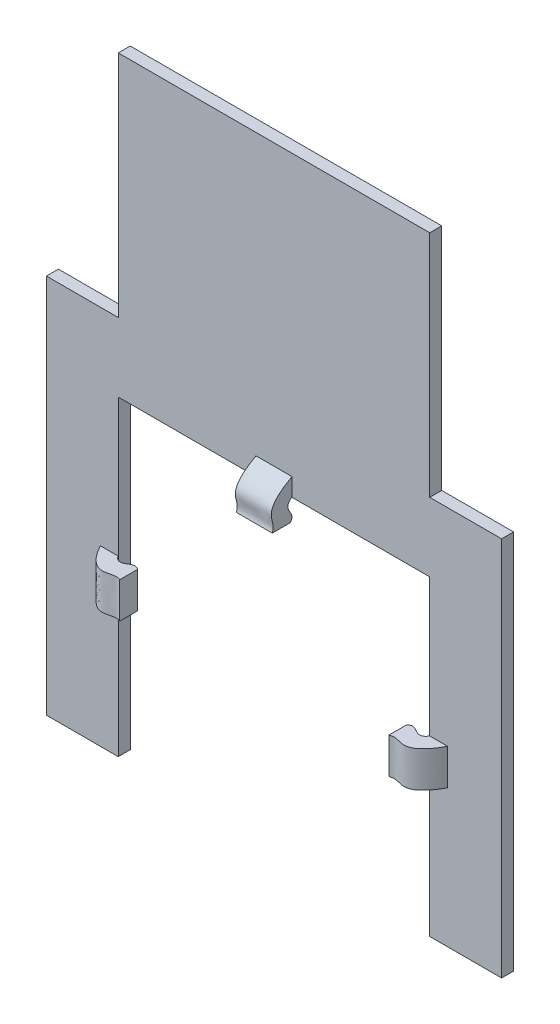
ISO-10303-21;
HEADER;
FILE_DESCRIPTION(('STEP AP214'),'2;1');
FILE_NAME('part.step','',(''),(''),'','','');
FILE_SCHEMA(('AUTOMOTIVE_DESIGN { 1 0 10303 214 1 1 1 1 }'));
ENDSEC;
DATA;
#1=APPLICATION_CONTEXT('core data for automotive mechanical design processes');
#2=APPLICATION_PROTOCOL_DEFINITION('international standard','automotive_design',2000,#1);
#3=PRODUCT_CONTEXT('',#1,'mechanical');
#4=PRODUCT('Part','Part','',(#3));
#5=PRODUCT_RELATED_PRODUCT_CATEGORY('part','',(#4));
#6=PRODUCT_DEFINITION_FORMATION('','',#4);
#7=PRODUCT_DEFINITION_CONTEXT('part definition',#1,'design');
#8=PRODUCT_DEFINITION('design','',#6,#7);
#9=PRODUCT_DEFINITION_SHAPE('','',#8);
#10=(LENGTH_UNIT() NAMED_UNIT(*) SI_UNIT(.MILLI.,.METRE.));
#11=(NAMED_UNIT(*) PLANE_ANGLE_UNIT() SI_UNIT($,.RADIAN.));
#12=(NAMED_UNIT(*) SI_UNIT($,.STERADIAN.) SOLID_ANGLE_UNIT());
#13=UNCERTAINTY_MEASURE_WITH_UNIT(LENGTH_MEASURE(1.E-05),#10,'distance_accuracy_value','');
#14=(GEOMETRIC_REPRESENTATION_CONTEXT(3) GLOBAL_UNCERTAINTY_ASSIGNED_CONTEXT((#13)) GLOBAL_UNIT_ASSIGNED_CONTEXT((#10,
#11,#12)) REPRESENTATION_CONTEXT('',''));
#15=CARTESIAN_POINT('',(0.,0.,0.));
#16=DIRECTION('',(0.,0.,1.));
#17=DIRECTION('',(1.,0.,0.));
#18=AXIS2_PLACEMENT_3D('',#15,#16,#17);
#19=CARTESIAN_POINT('',(0.,-15.315,1.));
#20=DIRECTION('',(0.,1.,0.));
#21=DIRECTION('',(0.,0.,1.));
#22=AXIS2_PLACEMENT_3D('',#19,#20,#21);
#23=PLANE('',#22);
#24=DIRECTION('',(1.,0.,0.));
#25=VECTOR('',#24,1.);
#26=CARTESIAN_POINT('',(0.,-15.315,0.));
#27=LINE('',#26,#25);
#28=CARTESIAN_POINT('',(-13.,-15.315,0.));
#29=VERTEX_POINT('',#28);
#30=CARTESIAN_POINT('',(13.,-15.315,0.));
#31=VERTEX_POINT('',#30);
#32=EDGE_CURVE('E300',#29,#31,#27,.T.);
#33=ORIENTED_EDGE('',*,*,#32,.T.);
#34=DIRECTION('',(0.,0.,-1.));
#35=VECTOR('',#34,1.);
#36=CARTESIAN_POINT('',(13.,-15.315,1.));
#37=LINE('',#36,#35);
#38=CARTESIAN_POINT('',(13.,-15.315,1.));
#39=VERTEX_POINT('',#38);
#40=EDGE_CURVE('E11',#39,#31,#37,.T.);
#41=ORIENTED_EDGE('',*,*,#40,.F.);
#42=DIRECTION('',(1.,0.,0.));
#43=VECTOR('',#42,1.);
#44=CARTESIAN_POINT('',(0.,-15.315,1.));
#45=LINE('',#44,#43);
#46=CARTESIAN_POINT('',(1.49999999999996,-15.315,1.));
#47=VERTEX_POINT('',#46);
#48=EDGE_CURVE('E312',#47,#39,#45,.T.);
#49=ORIENTED_EDGE('',*,*,#48,.F.);
#50=DIRECTION('',(1.,0.,0.));
#51=VECTOR('',#50,1.);
#52=CARTESIAN_POINT('',(-1.50000000000005,-15.315,1.));
#53=LINE('',#52,#51);
#54=CARTESIAN_POINT('',(-1.50000000000005,-15.315,1.));
#55=VERTEX_POINT('',#54);
#56=EDGE_CURVE('E492',#55,#47,#53,.T.);
#57=ORIENTED_EDGE('',*,*,#56,.F.);
#58=CARTESIAN_POINT('',(-13.,-15.315,1.));
#59=VERTEX_POINT('',#58);
#60=EDGE_CURVE('E308',#59,#55,#45,.T.);
#61=ORIENTED_EDGE('',*,*,#60,.F.);
#62=DIRECTION('',(0.,0.,-1.));
#63=VECTOR('',#62,1.);
#64=CARTESIAN_POINT('',(-13.,-15.315,1.));
#65=LINE('',#64,#63);
#66=EDGE_CURVE('E339',#59,#29,#65,.T.);
#67=ORIENTED_EDGE('',*,*,#66,.T.);
#68=EDGE_LOOP('',(#33,#41,#49,#57,#61,#67));
#69=FACE_BOUND('',#68,.T.);
#70=ADVANCED_FACE('F34',(#69),#23,.F.);
#71=CARTESIAN_POINT('',(13.,0.,1.));
#72=DIRECTION('',(1.,0.,0.));
#73=DIRECTION('',(0.,0.,-1.));
#74=AXIS2_PLACEMENT_3D('',#71,#72,#73);
#75=PLANE('',#74);
#76=DIRECTION('',(0.,-1.,0.));
#77=VECTOR('',#76,1.);
#78=CARTESIAN_POINT('',(13.,0.,0.));
#79=LINE('',#78,#77);
#80=CARTESIAN_POINT('',(13.,-41.315,0.));
#81=VERTEX_POINT('',#80);
#82=EDGE_CURVE('E343',#31,#81,#79,.T.);
#83=ORIENTED_EDGE('',*,*,#82,.T.);
#84=DIRECTION('',(0.,0.,-1.));
#85=VECTOR('',#84,1.);
#86=CARTESIAN_POINT('',(13.,-41.315,1.));
#87=LINE('',#86,#85);
#88=CARTESIAN_POINT('',(13.,-41.315,1.));
#89=VERTEX_POINT('',#88);
#90=EDGE_CURVE('E41',#89,#81,#87,.T.);
#91=ORIENTED_EDGE('',*,*,#90,.F.);
#92=DIRECTION('',(0.,-1.,0.));
#93=VECTOR('',#92,1.);
#94=CARTESIAN_POINT('',(13.,0.,1.));
#95=LINE('',#94,#93);
#96=CARTESIAN_POINT('',(13.,-29.815,1.));
#97=VERTEX_POINT('',#96);
#98=EDGE_CURVE('E311',#97,#89,#95,.T.);
#99=ORIENTED_EDGE('',*,*,#98,.F.);
#100=DIRECTION('',(0.,-1.,0.));
#101=VECTOR('',#100,1.);
#102=CARTESIAN_POINT('',(13.,-26.815,1.));
#103=LINE('',#102,#101);
#104=CARTESIAN_POINT('',(13.,-26.815,1.));
#105=VERTEX_POINT('',#104);
#106=EDGE_CURVE('E297',#105,#97,#103,.T.);
#107=ORIENTED_EDGE('',*,*,#106,.F.);
#108=EDGE_CURVE('E313',#39,#105,#95,.T.);
#109=ORIENTED_EDGE('',*,*,#108,.F.);
#110=ORIENTED_EDGE('',*,*,#40,.T.);
#111=EDGE_LOOP('',(#83,#91,#99,#107,#109,#110));
#112=FACE_BOUND('',#111,.T.);
#113=ADVANCED_FACE('F483',(#112),#75,.F.);
#114=CARTESIAN_POINT('',(0.,-41.315,1.));
#115=DIRECTION('',(0.,1.,0.));
#116=DIRECTION('',(0.,0.,1.));
#117=AXIS2_PLACEMENT_3D('',#114,#115,#116);
#118=PLANE('',#117);
#119=DIRECTION('',(1.,0.,0.));
#120=VECTOR('',#119,1.);
#121=CARTESIAN_POINT('',(0.,-41.315,0.));
#122=LINE('',#121,#120);
#123=CARTESIAN_POINT('',(19.,-41.315,0.));
#124=VERTEX_POINT('',#123);
#125=EDGE_CURVE('E345',#81,#124,#122,.T.);
#126=ORIENTED_EDGE('',*,*,#125,.T.);
#127=DIRECTION('',(0.,0.,-1.));
#128=VECTOR('',#127,1.);
#129=CARTESIAN_POINT('',(19.,-41.315,1.));
#130=LINE('',#129,#128);
#131=CARTESIAN_POINT('',(19.,-41.315,1.));
#132=VERTEX_POINT('',#131);
#133=EDGE_CURVE('E390',#132,#124,#130,.T.);
#134=ORIENTED_EDGE('',*,*,#133,.F.);
#135=DIRECTION('',(1.,0.,0.));
#136=VECTOR('',#135,1.);
#137=CARTESIAN_POINT('',(0.,-41.315,1.));
#138=LINE('',#137,#136);
#139=EDGE_CURVE('E316',#89,#132,#138,.T.);
#140=ORIENTED_EDGE('',*,*,#139,.F.);
#141=ORIENTED_EDGE('',*,*,#90,.T.);
#142=EDGE_LOOP('',(#126,#134,#140,#141));
#143=FACE_BOUND('',#142,.T.);
#144=ADVANCED_FACE('F396',(#143),#118,.F.);
#145=CARTESIAN_POINT('',(19.,0.,1.));
#146=DIRECTION('',(1.,0.,0.));
#147=DIRECTION('',(0.,1.,0.));
#148=AXIS2_PLACEMENT_3D('',#145,#146,#147);
#149=PLANE('',#148);
#150=DIRECTION('',(0.,-1.,0.));
#151=VECTOR('',#150,1.);
#152=CARTESIAN_POINT('',(19.,0.,0.));
#153=LINE('',#152,#151);
#154=CARTESIAN_POINT('',(19.,-9.56499999999999,0.));
#155=VERTEX_POINT('',#154);
#156=EDGE_CURVE('E348',#155,#124,#153,.T.);
#157=ORIENTED_EDGE('',*,*,#156,.F.);
#158=DIRECTION('',(0.,0.,-1.));
#159=VECTOR('',#158,1.);
#160=CARTESIAN_POINT('',(19.,-9.56499999999999,1.));
#161=LINE('',#160,#159);
#162=CARTESIAN_POINT('',(19.,-9.56499999999999,1.));
#163=VERTEX_POINT('',#162);
#164=EDGE_CURVE('E388',#163,#155,#161,.T.);
#165=ORIENTED_EDGE('',*,*,#164,.F.);
#166=DIRECTION('',(0.,-1.,0.));
#167=VECTOR('',#166,1.);
#168=CARTESIAN_POINT('',(19.,0.,1.));
#169=LINE('',#168,#167);
#170=EDGE_CURVE('E318',#163,#132,#169,.T.);
#171=ORIENTED_EDGE('',*,*,#170,.T.);
#172=ORIENTED_EDGE('',*,*,#133,.T.);
#173=EDGE_LOOP('',(#157,#165,#171,#172));
#174=FACE_BOUND('',#173,.T.);
#175=ADVANCED_FACE('F406',(#174),#149,.T.);
#176=CARTESIAN_POINT('',(0.,-9.56499999999999,1.));
#177=DIRECTION('',(0.,1.,0.));
#178=DIRECTION('',(0.,0.,1.));
#179=AXIS2_PLACEMENT_3D('',#176,#177,#178);
#180=PLANE('',#179);
#181=DIRECTION('',(1.,0.,0.));
#182=VECTOR('',#181,1.);
#183=CARTESIAN_POINT('',(0.,-9.56499999999999,0.));
#184=LINE('',#183,#182);
#185=CARTESIAN_POINT('',(13.,-9.56499999999999,0.));
#186=VERTEX_POINT('',#185);
#187=EDGE_CURVE('E352',#186,#155,#184,.T.);
#188=ORIENTED_EDGE('',*,*,#187,.F.);
#189=DIRECTION('',(0.,0.,-1.));
#190=VECTOR('',#189,1.);
#191=CARTESIAN_POINT('',(13.,-9.56499999999999,1.));
#192=LINE('',#191,#190);
#193=CARTESIAN_POINT('',(13.,-9.56499999999999,1.));
#194=VERTEX_POINT('',#193);
#195=EDGE_CURVE('E386',#194,#186,#192,.T.);
#196=ORIENTED_EDGE('',*,*,#195,.F.);
#197=DIRECTION('',(1.,0.,0.));
#198=VECTOR('',#197,1.);
#199=CARTESIAN_POINT('',(0.,-9.56499999999999,1.));
#200=LINE('',#199,#198);
#201=EDGE_CURVE('E322',#194,#163,#200,.T.);
#202=ORIENTED_EDGE('',*,*,#201,.T.);
#203=ORIENTED_EDGE('',*,*,#164,.T.);
#204=EDGE_LOOP('',(#188,#196,#202,#203));
#205=FACE_BOUND('',#204,.T.);
#206=ADVANCED_FACE('F411',(#205),#180,.T.);
#207=CARTESIAN_POINT('',(13.,0.,1.));
#208=DIRECTION('',(1.,0.,0.));
#209=DIRECTION('',(0.,0.,-1.));
#210=AXIS2_PLACEMENT_3D('',#207,#208,#209);
#211=PLANE('',#210);
#212=DIRECTION('',(0.,-1.,0.));
#213=VECTOR('',#212,1.);
#214=CARTESIAN_POINT('',(13.,0.,0.));
#215=LINE('',#214,#213);
#216=CARTESIAN_POINT('',(13.,9.565,0.));
#217=VERTEX_POINT('',#216);
#218=EDGE_CURVE('E355',#217,#186,#215,.T.);
#219=ORIENTED_EDGE('',*,*,#218,.F.);
#220=DIRECTION('',(0.,0.,-1.));
#221=VECTOR('',#220,1.);
#222=CARTESIAN_POINT('',(13.,9.565,1.));
#223=LINE('',#222,#221);
#224=CARTESIAN_POINT('',(13.,9.565,1.));
#225=VERTEX_POINT('',#224);
#226=EDGE_CURVE('E384',#225,#217,#223,.T.);
#227=ORIENTED_EDGE('',*,*,#226,.F.);
#228=DIRECTION('',(0.,-1.,0.));
#229=VECTOR('',#228,1.);
#230=CARTESIAN_POINT('',(13.,0.,1.));
#231=LINE('',#230,#229);
#232=EDGE_CURVE('E325',#225,#194,#231,.T.);
#233=ORIENTED_EDGE('',*,*,#232,.T.);
#234=ORIENTED_EDGE('',*,*,#195,.T.);
#235=EDGE_LOOP('',(#219,#227,#233,#234));
#236=FACE_BOUND('',#235,.T.);
#237=ADVANCED_FACE('F414',(#236),#211,.T.);
#238=CARTESIAN_POINT('',(0.,9.56500000000001,1.));
#239=DIRECTION('',(0.,-1.,0.));
#240=DIRECTION('',(1.,0.,0.));
#241=AXIS2_PLACEMENT_3D('',#238,#239,#240);
#242=PLANE('',#241);
#243=DIRECTION('',(-1.,0.,0.));
#244=VECTOR('',#243,1.);
#245=CARTESIAN_POINT('',(0.,9.56500000000001,0.));
#246=LINE('',#245,#244);
#247=CARTESIAN_POINT('',(-13.,9.56500000000001,0.));
#248=VERTEX_POINT('',#247);
#249=EDGE_CURVE('E358',#217,#248,#246,.T.);
#250=ORIENTED_EDGE('',*,*,#249,.T.);
#251=DIRECTION('',(0.,0.,-1.));
#252=VECTOR('',#251,1.);
#253=CARTESIAN_POINT('',(-13.,9.56500000000001,1.));
#254=LINE('',#253,#252);
#255=CARTESIAN_POINT('',(-13.,9.56500000000001,1.));
#256=VERTEX_POINT('',#255);
#257=EDGE_CURVE('E381',#256,#248,#254,.T.);
#258=ORIENTED_EDGE('',*,*,#257,.F.);
#259=DIRECTION('',(-1.,0.,0.));
#260=VECTOR('',#259,1.);
#261=CARTESIAN_POINT('',(0.,9.56500000000001,1.));
#262=LINE('',#261,#260);
#263=EDGE_CURVE('E328',#225,#256,#262,.T.);
#264=ORIENTED_EDGE('',*,*,#263,.F.);
#265=ORIENTED_EDGE('',*,*,#226,.T.);
#266=EDGE_LOOP('',(#250,#258,#264,#265));
#267=FACE_BOUND('',#266,.T.);
#268=ADVANCED_FACE('F421',(#267),#242,.F.);
#269=CARTESIAN_POINT('',(-13.,0.,1.));
#270=DIRECTION('',(1.,0.,0.));
#271=DIRECTION('',(0.,0.,-1.));
#272=AXIS2_PLACEMENT_3D('',#269,#270,#271);
#273=PLANE('',#272);
#274=DIRECTION('',(0.,-1.,0.));
#275=VECTOR('',#274,1.);
#276=CARTESIAN_POINT('',(-13.,0.,0.));
#277=LINE('',#276,#275);
#278=CARTESIAN_POINT('',(-13.,-9.56500000000001,0.));
#279=VERTEX_POINT('',#278);
#280=EDGE_CURVE('E360',#248,#279,#277,.T.);
#281=ORIENTED_EDGE('',*,*,#280,.T.);
#282=DIRECTION('',(0.,0.,-1.));
#283=VECTOR('',#282,1.);
#284=CARTESIAN_POINT('',(-13.,-9.56500000000001,1.));
#285=LINE('',#284,#283);
#286=CARTESIAN_POINT('',(-13.,-9.56500000000001,1.));
#287=VERTEX_POINT('',#286);
#288=EDGE_CURVE('E379',#287,#279,#285,.T.);
#289=ORIENTED_EDGE('',*,*,#288,.F.);
#290=DIRECTION('',(0.,-1.,0.));
#291=VECTOR('',#290,1.);
#292=CARTESIAN_POINT('',(-13.,0.,1.));
#293=LINE('',#292,#291);
#294=EDGE_CURVE('E330',#256,#287,#293,.T.);
#295=ORIENTED_EDGE('',*,*,#294,.F.);
#296=ORIENTED_EDGE('',*,*,#257,.T.);
#297=EDGE_LOOP('',(#281,#289,#295,#296));
#298=FACE_BOUND('',#297,.T.);
#299=ADVANCED_FACE('F425',(#298),#273,.F.);
#300=CARTESIAN_POINT('',(0.,-9.56500000000004,1.));
#301=DIRECTION('',(0.,1.,0.));
#302=DIRECTION('',(-1.,0.,0.));
#303=AXIS2_PLACEMENT_3D('',#300,#301,#302);
#304=PLANE('',#303);
#305=DIRECTION('',(1.,0.,0.));
#306=VECTOR('',#305,1.);
#307=CARTESIAN_POINT('',(0.,-9.56500000000004,0.));
#308=LINE('',#307,#306);
#309=CARTESIAN_POINT('',(-19.,-9.56499999999999,0.));
#310=VERTEX_POINT('',#309);
#311=EDGE_CURVE('E363',#310,#279,#308,.T.);
#312=ORIENTED_EDGE('',*,*,#311,.F.);
#313=DIRECTION('',(0.,0.,-1.));
#314=VECTOR('',#313,1.);
#315=CARTESIAN_POINT('',(-19.,-9.56499999999999,1.));
#316=LINE('',#315,#314);
#317=CARTESIAN_POINT('',(-19.,-9.56499999999999,1.));
#318=VERTEX_POINT('',#317);
#319=EDGE_CURVE('E377',#318,#310,#316,.T.);
#320=ORIENTED_EDGE('',*,*,#319,.F.);
#321=DIRECTION('',(1.,0.,0.));
#322=VECTOR('',#321,1.);
#323=CARTESIAN_POINT('',(0.,-9.56500000000004,1.));
#324=LINE('',#323,#322);
#325=EDGE_CURVE('E332',#318,#287,#324,.T.);
#326=ORIENTED_EDGE('',*,*,#325,.T.);
#327=ORIENTED_EDGE('',*,*,#288,.T.);
#328=EDGE_LOOP('',(#312,#320,#326,#327));
#329=FACE_BOUND('',#328,.T.);
#330=ADVANCED_FACE('F428',(#329),#304,.T.);
#331=CARTESIAN_POINT('',(-19.,0.,1.));
#332=DIRECTION('',(1.,0.,0.));
#333=DIRECTION('',(0.,0.,-1.));
#334=AXIS2_PLACEMENT_3D('',#331,#332,#333);
#335=PLANE('',#334);
#336=DIRECTION('',(0.,-1.,0.));
#337=VECTOR('',#336,1.);
#338=CARTESIAN_POINT('',(-19.,0.,0.));
#339=LINE('',#338,#337);
#340=CARTESIAN_POINT('',(-19.,-41.315,0.));
#341=VERTEX_POINT('',#340);
#342=EDGE_CURVE('E366',#310,#341,#339,.T.);
#343=ORIENTED_EDGE('',*,*,#342,.T.);
#344=DIRECTION('',(0.,0.,-1.));
#345=VECTOR('',#344,1.);
#346=CARTESIAN_POINT('',(-19.,-41.315,1.));
#347=LINE('',#346,#345);
#348=CARTESIAN_POINT('',(-19.,-41.315,1.));
#349=VERTEX_POINT('',#348);
#350=EDGE_CURVE('E374',#349,#341,#347,.T.);
#351=ORIENTED_EDGE('',*,*,#350,.F.);
#352=DIRECTION('',(0.,-1.,0.));
#353=VECTOR('',#352,1.);
#354=CARTESIAN_POINT('',(-19.,0.,1.));
#355=LINE('',#354,#353);
#356=EDGE_CURVE('E335',#318,#349,#355,.T.);
#357=ORIENTED_EDGE('',*,*,#356,.F.);
#358=ORIENTED_EDGE('',*,*,#319,.T.);
#359=EDGE_LOOP('',(#343,#351,#357,#358));
#360=FACE_BOUND('',#359,.T.);
#361=ADVANCED_FACE('F435',(#360),#335,.F.);
#362=CARTESIAN_POINT('',(-13.,-41.315,0.));
#363=VERTEX_POINT('',#362);
#364=EDGE_CURVE('E349',#341,#363,#122,.T.);
#365=ORIENTED_EDGE('',*,*,#364,.T.);
#366=DIRECTION('',(0.,0.,-1.));
#367=VECTOR('',#366,1.);
#368=CARTESIAN_POINT('',(-13.,-41.315,1.));
#369=LINE('',#368,#367);
#370=CARTESIAN_POINT('',(-13.,-41.315,1.));
#371=VERTEX_POINT('',#370);
#372=EDGE_CURVE('E372',#371,#363,#369,.T.);
#373=ORIENTED_EDGE('',*,*,#372,.F.);
#374=EDGE_CURVE('E319',#349,#371,#138,.T.);
#375=ORIENTED_EDGE('',*,*,#374,.F.);
#376=ORIENTED_EDGE('',*,*,#350,.T.);
#377=EDGE_LOOP('',(#365,#373,#375,#376));
#378=FACE_BOUND('',#377,.T.);
#379=ADVANCED_FACE('F440',(#378),#118,.F.);
#380=CARTESIAN_POINT('',(-13.,0.,1.));
#381=DIRECTION('',(1.,0.,0.));
#382=DIRECTION('',(0.,0.,-1.));
#383=AXIS2_PLACEMENT_3D('',#380,#381,#382);
#384=PLANE('',#383);
#385=DIRECTION('',(0.,-1.,0.));
#386=VECTOR('',#385,1.);
#387=CARTESIAN_POINT('',(-13.,0.,0.));
#388=LINE('',#387,#386);
#389=EDGE_CURVE('E368',#29,#363,#388,.T.);
#390=ORIENTED_EDGE('',*,*,#389,.F.);
#391=ORIENTED_EDGE('',*,*,#66,.F.);
#392=DIRECTION('',(0.,-1.,0.));
#393=VECTOR('',#392,1.);
#394=CARTESIAN_POINT('',(-13.,0.,1.));
#395=LINE('',#394,#393);
#396=CARTESIAN_POINT('',(-13.,-26.815,1.));
#397=VERTEX_POINT('',#396);
#398=EDGE_CURVE('E337',#59,#397,#395,.T.);
#399=ORIENTED_EDGE('',*,*,#398,.T.);
#400=DIRECTION('',(0.,1.,0.));
#401=VECTOR('',#400,1.);
#402=CARTESIAN_POINT('',(-13.,-29.815,1.));
#403=LINE('',#402,#401);
#404=CARTESIAN_POINT('',(-13.,-29.815,1.));
#405=VERTEX_POINT('',#404);
#406=EDGE_CURVE('E217',#405,#397,#403,.T.);
#407=ORIENTED_EDGE('',*,*,#406,.F.);
#408=EDGE_CURVE('E340',#405,#371,#395,.T.);
#409=ORIENTED_EDGE('',*,*,#408,.T.);
#410=ORIENTED_EDGE('',*,*,#372,.T.);
#411=EDGE_LOOP('',(#390,#391,#399,#407,#409,#410));
#412=FACE_BOUND('',#411,.T.);
#413=ADVANCED_FACE('F444',(#412),#384,.T.);
#414=CARTESIAN_POINT('',(0.,0.,1.));
#415=DIRECTION('',(0.,0.,1.));
#416=DIRECTION('',(1.,0.,0.));
#417=AXIS2_PLACEMENT_3D('',#414,#415,#416);
#418=PLANE('',#417);
#419=DIRECTION('',(-1.,0.,0.));
#420=VECTOR('',#419,1.);
#421=CARTESIAN_POINT('',(-14.5,-29.815,1.));
#422=LINE('',#421,#420);
#423=CARTESIAN_POINT('',(-14.5,-29.815,1.));
#424=VERTEX_POINT('',#423);
#425=EDGE_CURVE('E216',#405,#424,#422,.T.);
#426=ORIENTED_EDGE('',*,*,#425,.T.);
#427=DIRECTION('',(0.,1.,0.));
#428=VECTOR('',#427,1.);
#429=CARTESIAN_POINT('',(-14.5,-29.815,1.));
#430=LINE('',#429,#428);
#431=CARTESIAN_POINT('',(-14.5,-26.815,1.));
#432=VERTEX_POINT('',#431);
#433=EDGE_CURVE('E208',#424,#432,#430,.T.);
#434=ORIENTED_EDGE('',*,*,#433,.T.);
#435=DIRECTION('',(-1.,0.,0.));
#436=VECTOR('',#435,1.);
#437=CARTESIAN_POINT('',(-14.5,-26.815,1.));
#438=LINE('',#437,#436);
#439=EDGE_CURVE('E195',#397,#432,#438,.T.);
#440=ORIENTED_EDGE('',*,*,#439,.F.);
#441=ORIENTED_EDGE('',*,*,#398,.F.);
#442=ORIENTED_EDGE('',*,*,#60,.T.);
#443=DIRECTION('',(0.,1.,0.));
#444=VECTOR('',#443,1.);
#445=CARTESIAN_POINT('',(-1.50000000000005,-13.815,1.));
#446=LINE('',#445,#444);
#447=CARTESIAN_POINT('',(-1.50000000000005,-13.815,1.));
#448=VERTEX_POINT('',#447);
#449=EDGE_CURVE('E249',#55,#448,#446,.T.);
#450=ORIENTED_EDGE('',*,*,#449,.T.);
#451=DIRECTION('',(1.,0.,0.));
#452=VECTOR('',#451,1.);
#453=CARTESIAN_POINT('',(-1.50000000000005,-13.815,1.));
#454=LINE('',#453,#452);
#455=CARTESIAN_POINT('',(1.49999999999995,-13.815,1.));
#456=VERTEX_POINT('',#455);
#457=EDGE_CURVE('E496',#448,#456,#454,.T.);
#458=ORIENTED_EDGE('',*,*,#457,.T.);
#459=DIRECTION('',(0.,1.,0.));
#460=VECTOR('',#459,1.);
#461=CARTESIAN_POINT('',(1.49999999999995,-13.815,1.));
#462=LINE('',#461,#460);
#463=EDGE_CURVE('E228',#47,#456,#462,.T.);
#464=ORIENTED_EDGE('',*,*,#463,.F.);
#465=ORIENTED_EDGE('',*,*,#48,.T.);
#466=ORIENTED_EDGE('',*,*,#108,.T.);
#467=DIRECTION('',(1.,0.,0.));
#468=VECTOR('',#467,1.);
#469=CARTESIAN_POINT('',(14.5,-26.815,1.));
#470=LINE('',#469,#468);
#471=CARTESIAN_POINT('',(14.5,-26.815,1.));
#472=VERTEX_POINT('',#471);
#473=EDGE_CURVE('E291',#105,#472,#470,.T.);
#474=ORIENTED_EDGE('',*,*,#473,.T.);
#475=DIRECTION('',(0.,-1.,0.));
#476=VECTOR('',#475,1.);
#477=CARTESIAN_POINT('',(14.5,-26.815,1.));
#478=LINE('',#477,#476);
#479=CARTESIAN_POINT('',(14.5,-29.815,1.));
#480=VERTEX_POINT('',#479);
#481=EDGE_CURVE('E303',#472,#480,#478,.T.);
#482=ORIENTED_EDGE('',*,*,#481,.T.);
#483=DIRECTION('',(1.,0.,0.));
#484=VECTOR('',#483,1.);
#485=CARTESIAN_POINT('',(14.5,-29.815,1.));
#486=LINE('',#485,#484);
#487=EDGE_CURVE('E522',#97,#480,#486,.T.);
#488=ORIENTED_EDGE('',*,*,#487,.F.);
#489=ORIENTED_EDGE('',*,*,#98,.T.);
#490=ORIENTED_EDGE('',*,*,#139,.T.);
#491=ORIENTED_EDGE('',*,*,#170,.F.);
#492=ORIENTED_EDGE('',*,*,#201,.F.);
#493=ORIENTED_EDGE('',*,*,#232,.F.);
#494=ORIENTED_EDGE('',*,*,#263,.T.);
#495=ORIENTED_EDGE('',*,*,#294,.T.);
#496=ORIENTED_EDGE('',*,*,#325,.F.);
#497=ORIENTED_EDGE('',*,*,#356,.T.);
#498=ORIENTED_EDGE('',*,*,#374,.T.);
#499=ORIENTED_EDGE('',*,*,#408,.F.);
#500=EDGE_LOOP('',(#426,#434,#440,#441,#442,#450,#458,#464,#465,#466,#474,#482,#488,#489,#490,
#491,#492,#493,#494,#495,#496,#497,#498,#499));
#501=FACE_BOUND('',#500,.T.);
#502=ADVANCED_FACE('F214',(#501),#418,.T.);
#503=CARTESIAN_POINT('',(0.,0.,0.));
#504=DIRECTION('',(0.,0.,1.));
#505=DIRECTION('',(1.,0.,0.));
#506=AXIS2_PLACEMENT_3D('',#503,#504,#505);
#507=PLANE('',#506);
#508=ORIENTED_EDGE('',*,*,#32,.F.);
#509=ORIENTED_EDGE('',*,*,#389,.T.);
#510=ORIENTED_EDGE('',*,*,#364,.F.);
#511=ORIENTED_EDGE('',*,*,#342,.F.);
#512=ORIENTED_EDGE('',*,*,#311,.T.);
#513=ORIENTED_EDGE('',*,*,#280,.F.);
#514=ORIENTED_EDGE('',*,*,#249,.F.);
#515=ORIENTED_EDGE('',*,*,#218,.T.);
#516=ORIENTED_EDGE('',*,*,#187,.T.);
#517=ORIENTED_EDGE('',*,*,#156,.T.);
#518=ORIENTED_EDGE('',*,*,#125,.F.);
#519=ORIENTED_EDGE('',*,*,#82,.F.);
#520=EDGE_LOOP('',(#508,#509,#510,#511,#512,#513,#514,#515,#516,#517,#518,#519));
#521=FACE_BOUND('',#520,.T.);
#522=ADVANCED_FACE('F402',(#521),#507,.F.);
#523=CARTESIAN_POINT('',(11.2352227102018,-26.815,1.14428635899944));
#524=CARTESIAN_POINT('',(11.7401748776942,-26.815,0.757764955807261));
#525=CARTESIAN_POINT('',(12.028679887344,-26.815,1.16153483698045));
#526=CARTESIAN_POINT('',(12.2278692219438,-26.815,1.50300226772298));
#527=CARTESIAN_POINT('',(12.7471842728648,-26.815,1.48877445810871));
#528=CARTESIAN_POINT('',(13.,-26.815,1.));
#529=B_SPLINE_CURVE_WITH_KNOTS('',5,(#523,#524,#525,#526,#527,#528),.UNSPECIFIED.,.F.,.F.,(6,6),
(0.,1.),.UNSPECIFIED.);
#530=DIRECTION('',(0.,-1.,0.));
#531=VECTOR('',#530,1.);
#532=SURFACE_OF_LINEAR_EXTRUSION('',#529,#531);
#533=ORIENTED_EDGE('',*,*,#106,.T.);
#534=CARTESIAN_POINT('',(11.2352227102018,-29.815,1.14428635899944));
#535=CARTESIAN_POINT('',(11.7401748776942,-29.815,0.757764955807261));
#536=CARTESIAN_POINT('',(12.028679887344,-29.815,1.16153483698045));
#537=CARTESIAN_POINT('',(12.2278692219438,-29.815,1.50300226772298));
#538=CARTESIAN_POINT('',(12.7471842728648,-29.815,1.48877445810871));
#539=CARTESIAN_POINT('',(13.,-29.815,1.));
#540=B_SPLINE_CURVE_WITH_KNOTS('',5,(#534,#535,#536,#537,#538,#539),.UNSPECIFIED.,.F.,.F.,(6,6),
(0.,1.),.UNSPECIFIED.);
#541=CARTESIAN_POINT('',(11.2352227102018,-29.815,1.14428635899944));
#542=VERTEX_POINT('',#541);
#543=EDGE_CURVE('E514',#542,#97,#540,.T.);
#544=ORIENTED_EDGE('',*,*,#543,.F.);
#545=DIRECTION('',(0.,-1.,0.));
#546=VECTOR('',#545,1.);
#547=CARTESIAN_POINT('',(11.2352227102018,-26.815,1.14428635899944));
#548=LINE('',#547,#546);
#549=CARTESIAN_POINT('',(11.2352227102018,-26.815,1.14428635899944));
#550=VERTEX_POINT('',#549);
#551=EDGE_CURVE('E298',#550,#542,#548,.T.);
#552=ORIENTED_EDGE('',*,*,#551,.F.);
#553=EDGE_CURVE('E537',#550,#105,#529,.T.);
#554=ORIENTED_EDGE('',*,*,#553,.T.);
#555=EDGE_LOOP('',(#533,#544,#552,#554));
#556=FACE_BOUND('',#555,.T.);
#557=ADVANCED_FACE('F275',(#556),#532,.T.);
#558=CARTESIAN_POINT('',(11.2352227102018,-26.815,1.14428635899944));
#559=DIRECTION('',(-1.,0.,0.));
#560=DIRECTION('',(0.,0.,1.));
#561=AXIS2_PLACEMENT_3D('',#558,#559,#560);
#562=PLANE('',#561);
#563=ORIENTED_EDGE('',*,*,#551,.T.);
#564=DIRECTION('',(0.,0.,-1.));
#565=VECTOR('',#564,1.);
#566=CARTESIAN_POINT('',(11.2352227102018,-29.815,1.14428635899944));
#567=LINE('',#566,#565);
#568=CARTESIAN_POINT('',(11.2352227102018,-29.815,2.64428635899944));
#569=VERTEX_POINT('',#568);
#570=EDGE_CURVE('E532',#569,#542,#567,.T.);
#571=ORIENTED_EDGE('',*,*,#570,.F.);
#572=DIRECTION('',(0.,-1.,0.));
#573=VECTOR('',#572,1.);
#574=CARTESIAN_POINT('',(11.2352227102018,-26.815,2.64428635899944));
#575=LINE('',#574,#573);
#576=CARTESIAN_POINT('',(11.2352227102018,-26.815,2.64428635899944));
#577=VERTEX_POINT('',#576);
#578=EDGE_CURVE('E301',#577,#569,#575,.T.);
#579=ORIENTED_EDGE('',*,*,#578,.F.);
#580=DIRECTION('',(0.,0.,-1.));
#581=VECTOR('',#580,1.);
#582=CARTESIAN_POINT('',(11.2352227102018,-26.815,1.14428635899944));
#583=LINE('',#582,#581);
#584=EDGE_CURVE('E290',#577,#550,#583,.T.);
#585=ORIENTED_EDGE('',*,*,#584,.T.);
#586=EDGE_LOOP('',(#563,#571,#579,#585));
#587=FACE_BOUND('',#586,.T.);
#588=ADVANCED_FACE('F272',(#587),#562,.T.);
#589=CARTESIAN_POINT('',(14.5,-26.815,1.));
#590=CARTESIAN_POINT('',(13.7608870647909,-26.815,2.41490657246146));
#591=CARTESIAN_POINT('',(12.6782415800335,-26.815,3.40768712019468));
#592=CARTESIAN_POINT('',(12.3450954284863,-26.815,2.5259518349543));
#593=CARTESIAN_POINT('',(11.7215069004715,-26.815,2.45085660240818));
#594=CARTESIAN_POINT('',(11.2352227102018,-26.815,2.64428635899944));
#595=B_SPLINE_CURVE_WITH_KNOTS('',5,(#589,#590,#591,#592,#593,#594),.UNSPECIFIED.,.F.,.F.,(6,6),
(0.,1.),.UNSPECIFIED.);
#596=DIRECTION('',(0.,-1.,0.));
#597=VECTOR('',#596,1.);
#598=SURFACE_OF_LINEAR_EXTRUSION('',#595,#597);
#599=ORIENTED_EDGE('',*,*,#578,.T.);
#600=CARTESIAN_POINT('',(14.5,-29.815,1.));
#601=CARTESIAN_POINT('',(13.7608870647909,-29.815,2.41490657246146));
#602=CARTESIAN_POINT('',(12.6782415800335,-29.815,3.40768712019468));
#603=CARTESIAN_POINT('',(12.3450954284863,-29.815,2.5259518349543));
#604=CARTESIAN_POINT('',(11.7215069004715,-29.815,2.45085660240818));
#605=CARTESIAN_POINT('',(11.2352227102018,-29.815,2.64428635899944));
#606=B_SPLINE_CURVE_WITH_KNOTS('',5,(#600,#601,#602,#603,#604,#605),.UNSPECIFIED.,.F.,.F.,(6,6),
(0.,1.),.UNSPECIFIED.);
#607=EDGE_CURVE('E527',#480,#569,#606,.T.);
#608=ORIENTED_EDGE('',*,*,#607,.F.);
#609=ORIENTED_EDGE('',*,*,#481,.F.);
#610=EDGE_CURVE('E283',#472,#577,#595,.T.);
#611=ORIENTED_EDGE('',*,*,#610,.T.);
#612=EDGE_LOOP('',(#599,#608,#609,#611));
#613=FACE_BOUND('',#612,.T.);
#614=ADVANCED_FACE('F270',(#613),#598,.T.);
#615=CARTESIAN_POINT('',(12.1636721736211,-26.815,1.25069857736293));
#616=DIRECTION('',(0.,1.,0.));
#617=DIRECTION('',(0.,0.,1.));
#618=AXIS2_PLACEMENT_3D('',#615,#616,#617);
#619=PLANE('',#618);
#620=ORIENTED_EDGE('',*,*,#553,.F.);
#621=ORIENTED_EDGE('',*,*,#584,.F.);
#622=ORIENTED_EDGE('',*,*,#610,.F.);
#623=ORIENTED_EDGE('',*,*,#473,.F.);
#624=EDGE_LOOP('',(#620,#621,#622,#623));
#625=FACE_BOUND('',#624,.T.);
#626=ADVANCED_FACE('F266',(#625),#619,.T.);
#627=CARTESIAN_POINT('',(12.1636721736211,-29.815,1.25069857736293));
#628=DIRECTION('',(0.,1.,0.));
#629=DIRECTION('',(0.,0.,1.));
#630=AXIS2_PLACEMENT_3D('',#627,#628,#629);
#631=PLANE('',#630);
#632=ORIENTED_EDGE('',*,*,#543,.T.);
#633=ORIENTED_EDGE('',*,*,#487,.T.);
#634=ORIENTED_EDGE('',*,*,#607,.T.);
#635=ORIENTED_EDGE('',*,*,#570,.T.);
#636=EDGE_LOOP('',(#632,#633,#634,#635));
#637=FACE_BOUND('',#636,.T.);
#638=ADVANCED_FACE('F260',(#637),#631,.F.);
#639=CARTESIAN_POINT('',(-1.50000000000004,-17.0797772897982,1.14428635899944));
#640=CARTESIAN_POINT('',(-1.50000000000004,-16.5748251223058,0.757764955807261));
#641=CARTESIAN_POINT('',(-1.50000000000004,-16.286320112656,1.16153483698045));
#642=CARTESIAN_POINT('',(-1.50000000000004,-16.0871307780562,1.50300226772298));
#643=CARTESIAN_POINT('',(-1.50000000000005,-15.5678157271352,1.48877445810871));
#644=CARTESIAN_POINT('',(-1.50000000000005,-15.315,1.));
#645=B_SPLINE_CURVE_WITH_KNOTS('',5,(#639,#640,#641,#642,#643,#644),.UNSPECIFIED.,.F.,.F.,(6,6),
(0.,1.),.UNSPECIFIED.);
#646=DIRECTION('',(1.,0.,0.));
#647=VECTOR('',#646,1.);
#648=SURFACE_OF_LINEAR_EXTRUSION('',#645,#647);
#649=ORIENTED_EDGE('',*,*,#56,.T.);
#650=CARTESIAN_POINT('',(1.49999999999996,-17.0797772897982,1.14428635899944));
#651=CARTESIAN_POINT('',(1.49999999999996,-16.5748251223058,0.757764955807261));
#652=CARTESIAN_POINT('',(1.49999999999996,-16.286320112656,1.16153483698045));
#653=CARTESIAN_POINT('',(1.49999999999996,-16.0871307780562,1.50300226772298));
#654=CARTESIAN_POINT('',(1.49999999999995,-15.5678157271352,1.48877445810871));
#655=CARTESIAN_POINT('',(1.49999999999995,-15.315,1.));
#656=B_SPLINE_CURVE_WITH_KNOTS('',5,(#650,#651,#652,#653,#654,#655),.UNSPECIFIED.,.F.,.F.,(6,6),
(0.,1.),.UNSPECIFIED.);
#657=CARTESIAN_POINT('',(1.49999999999996,-17.0797772897982,1.14428635899944));
#658=VERTEX_POINT('',#657);
#659=EDGE_CURVE('E56',#658,#47,#656,.T.);
#660=ORIENTED_EDGE('',*,*,#659,.F.);
#661=DIRECTION('',(1.,0.,0.));
#662=VECTOR('',#661,1.);
#663=CARTESIAN_POINT('',(-1.50000000000004,-17.0797772897982,1.14428635899944));
#664=LINE('',#663,#662);
#665=CARTESIAN_POINT('',(-1.50000000000004,-17.0797772897982,1.14428635899944));
#666=VERTEX_POINT('',#665);
#667=EDGE_CURVE('E512',#666,#658,#664,.T.);
#668=ORIENTED_EDGE('',*,*,#667,.F.);
#669=EDGE_CURVE('E243',#666,#55,#645,.T.);
#670=ORIENTED_EDGE('',*,*,#669,.T.);
#671=EDGE_LOOP('',(#649,#660,#668,#670));
#672=FACE_BOUND('',#671,.T.);
#673=ADVANCED_FACE('F255',(#672),#648,.T.);
#674=CARTESIAN_POINT('',(-1.50000000000004,-17.0797772897982,1.14428635899944));
#675=DIRECTION('',(0.,-1.,0.));
#676=DIRECTION('',(1.,0.,0.));
#677=AXIS2_PLACEMENT_3D('',#674,#675,#676);
#678=PLANE('',#677);
#679=ORIENTED_EDGE('',*,*,#667,.T.);
#680=DIRECTION('',(0.,0.,-1.));
#681=VECTOR('',#680,1.);
#682=CARTESIAN_POINT('',(1.49999999999996,-17.0797772897982,1.14428635899944));
#683=LINE('',#682,#681);
#684=CARTESIAN_POINT('',(1.49999999999996,-17.0797772897982,2.64428635899944));
#685=VERTEX_POINT('',#684);
#686=EDGE_CURVE('E238',#685,#658,#683,.T.);
#687=ORIENTED_EDGE('',*,*,#686,.F.);
#688=DIRECTION('',(1.,0.,0.));
#689=VECTOR('',#688,1.);
#690=CARTESIAN_POINT('',(-1.50000000000004,-17.0797772897982,2.64428635899944));
#691=LINE('',#690,#689);
#692=CARTESIAN_POINT('',(-1.50000000000004,-17.0797772897982,2.64428635899944));
#693=VERTEX_POINT('',#692);
#694=EDGE_CURVE('E515',#693,#685,#691,.T.);
#695=ORIENTED_EDGE('',*,*,#694,.F.);
#696=DIRECTION('',(0.,0.,-1.));
#697=VECTOR('',#696,1.);
#698=CARTESIAN_POINT('',(-1.50000000000004,-17.0797772897982,1.14428635899944));
#699=LINE('',#698,#697);
#700=EDGE_CURVE('E501',#693,#666,#699,.T.);
#701=ORIENTED_EDGE('',*,*,#700,.T.);
#702=EDGE_LOOP('',(#679,#687,#695,#701));
#703=FACE_BOUND('',#702,.T.);
#704=ADVANCED_FACE('F259',(#703),#678,.T.);
#705=CARTESIAN_POINT('',(-1.50000000000005,-13.815,1.));
#706=CARTESIAN_POINT('',(-1.50000000000005,-14.554112935209,2.41490657246146));
#707=CARTESIAN_POINT('',(-1.50000000000005,-15.6367584199665,3.40768712019468));
#708=CARTESIAN_POINT('',(-1.50000000000004,-15.9699045715137,2.5259518349543));
#709=CARTESIAN_POINT('',(-1.50000000000004,-16.5934930995285,2.45085660240818));
#710=CARTESIAN_POINT('',(-1.50000000000004,-17.0797772897982,2.64428635899944));
#711=B_SPLINE_CURVE_WITH_KNOTS('',5,(#705,#706,#707,#708,#709,#710),.UNSPECIFIED.,.F.,.F.,(6,6),
(0.,1.),.UNSPECIFIED.);
#712=DIRECTION('',(1.,0.,0.));
#713=VECTOR('',#712,1.);
#714=SURFACE_OF_LINEAR_EXTRUSION('',#711,#713);
#715=ORIENTED_EDGE('',*,*,#694,.T.);
#716=CARTESIAN_POINT('',(1.49999999999995,-13.815,1.));
#717=CARTESIAN_POINT('',(1.49999999999995,-14.554112935209,2.41490657246146));
#718=CARTESIAN_POINT('',(1.49999999999995,-15.6367584199665,3.40768712019468));
#719=CARTESIAN_POINT('',(1.49999999999996,-15.9699045715137,2.5259518349543));
#720=CARTESIAN_POINT('',(1.49999999999996,-16.5934930995285,2.45085660240818));
#721=CARTESIAN_POINT('',(1.49999999999996,-17.0797772897982,2.64428635899944));
#722=B_SPLINE_CURVE_WITH_KNOTS('',5,(#716,#717,#718,#719,#720,#721),.UNSPECIFIED.,.F.,.F.,(6,6),
(0.,1.),.UNSPECIFIED.);
#723=EDGE_CURVE('E233',#456,#685,#722,.T.);
#724=ORIENTED_EDGE('',*,*,#723,.F.);
#725=ORIENTED_EDGE('',*,*,#457,.F.);
#726=EDGE_CURVE('E499',#448,#693,#711,.T.);
#727=ORIENTED_EDGE('',*,*,#726,.T.);
#728=EDGE_LOOP('',(#715,#724,#725,#727));
#729=FACE_BOUND('',#728,.T.);
#730=ADVANCED_FACE('F262',(#729),#714,.T.);
#731=CARTESIAN_POINT('',(-1.50000000000004,-16.1513278263789,1.25069857736293));
#732=DIRECTION('',(-1.,0.,0.));
#733=DIRECTION('',(0.,0.,1.));
#734=AXIS2_PLACEMENT_3D('',#731,#732,#733);
#735=PLANE('',#734);
#736=ORIENTED_EDGE('',*,*,#669,.F.);
#737=ORIENTED_EDGE('',*,*,#700,.F.);
#738=ORIENTED_EDGE('',*,*,#726,.F.);
#739=ORIENTED_EDGE('',*,*,#449,.F.);
#740=EDGE_LOOP('',(#736,#737,#738,#739));
#741=FACE_BOUND('',#740,.T.);
#742=ADVANCED_FACE('F473',(#741),#735,.T.);
#743=CARTESIAN_POINT('',(1.49999999999996,-16.1513278263789,1.25069857736293));
#744=DIRECTION('',(-1.,0.,0.));
#745=DIRECTION('',(0.,0.,1.));
#746=AXIS2_PLACEMENT_3D('',#743,#744,#745);
#747=PLANE('',#746);
#748=ORIENTED_EDGE('',*,*,#659,.T.);
#749=ORIENTED_EDGE('',*,*,#463,.T.);
#750=ORIENTED_EDGE('',*,*,#723,.T.);
#751=ORIENTED_EDGE('',*,*,#686,.T.);
#752=EDGE_LOOP('',(#748,#749,#750,#751));
#753=FACE_BOUND('',#752,.T.);
#754=ADVANCED_FACE('F469',(#753),#747,.F.);
#755=CARTESIAN_POINT('',(-11.2352227102018,-29.815,1.14428635899944));
#756=CARTESIAN_POINT('',(-11.7401748776942,-29.815,0.757764955807261));
#757=CARTESIAN_POINT('',(-12.028679887344,-29.815,1.16153483698045));
#758=CARTESIAN_POINT('',(-12.2278692219438,-29.815,1.50300226772298));
#759=CARTESIAN_POINT('',(-12.7471842728648,-29.815,1.48877445810871));
#760=CARTESIAN_POINT('',(-13.,-29.815,1.));
#761=B_SPLINE_CURVE_WITH_KNOTS('',5,(#755,#756,#757,#758,#759,#760),.UNSPECIFIED.,.F.,.F.,(6,6),
(0.,1.),.UNSPECIFIED.);
#762=DIRECTION('',(0.,1.,0.));
#763=VECTOR('',#762,1.);
#764=SURFACE_OF_LINEAR_EXTRUSION('',#761,#763);
#765=ORIENTED_EDGE('',*,*,#406,.T.);
#766=CARTESIAN_POINT('',(-11.2352227102018,-26.815,1.14428635899944));
#767=CARTESIAN_POINT('',(-11.7401748776942,-26.815,0.757764955807261));
#768=CARTESIAN_POINT('',(-12.028679887344,-26.815,1.16153483698045));
#769=CARTESIAN_POINT('',(-12.2278692219438,-26.815,1.50300226772298));
#770=CARTESIAN_POINT('',(-12.7471842728648,-26.815,1.48877445810871));
#771=CARTESIAN_POINT('',(-13.,-26.815,1.));
#772=B_SPLINE_CURVE_WITH_KNOTS('',5,(#766,#767,#768,#769,#770,#771),.UNSPECIFIED.,.F.,.F.,(6,6),
(0.,1.),.UNSPECIFIED.);
#773=CARTESIAN_POINT('',(-11.2352227102018,-26.815,1.14428635899944));
#774=VERTEX_POINT('',#773);
#775=EDGE_CURVE('E48',#774,#397,#772,.T.);
#776=ORIENTED_EDGE('',*,*,#775,.F.);
#777=DIRECTION('',(0.,1.,0.));
#778=VECTOR('',#777,1.);
#779=CARTESIAN_POINT('',(-11.2352227102018,-29.815,1.14428635899944));
#780=LINE('',#779,#778);
#781=CARTESIAN_POINT('',(-11.2352227102018,-29.815,1.14428635899944));
#782=VERTEX_POINT('',#781);
#783=EDGE_CURVE('E219',#782,#774,#780,.T.);
#784=ORIENTED_EDGE('',*,*,#783,.F.);
#785=EDGE_CURVE('E449',#782,#405,#761,.T.);
#786=ORIENTED_EDGE('',*,*,#785,.T.);
#787=EDGE_LOOP('',(#765,#776,#784,#786));
#788=FACE_BOUND('',#787,.T.);
#789=ADVANCED_FACE('F447',(#788),#764,.T.);
#790=CARTESIAN_POINT('',(-11.2352227102018,-29.815,1.14428635899944));
#791=DIRECTION('',(1.,0.,0.));
#792=DIRECTION('',(0.,0.,-1.));
#793=AXIS2_PLACEMENT_3D('',#790,#791,#792);
#794=PLANE('',#793);
#795=ORIENTED_EDGE('',*,*,#783,.T.);
#796=DIRECTION('',(0.,0.,-1.));
#797=VECTOR('',#796,1.);
#798=CARTESIAN_POINT('',(-11.2352227102018,-26.815,1.14428635899944));
#799=LINE('',#798,#797);
#800=CARTESIAN_POINT('',(-11.2352227102018,-26.815,2.64428635899944));
#801=VERTEX_POINT('',#800);
#802=EDGE_CURVE('E211',#801,#774,#799,.T.);
#803=ORIENTED_EDGE('',*,*,#802,.F.);
#804=DIRECTION('',(0.,1.,0.));
#805=VECTOR('',#804,1.);
#806=CARTESIAN_POINT('',(-11.2352227102018,-29.815,2.64428635899944));
#807=LINE('',#806,#805);
#808=CARTESIAN_POINT('',(-11.2352227102018,-29.815,2.64428635899944));
#809=VERTEX_POINT('',#808);
#810=EDGE_CURVE('E210',#809,#801,#807,.T.);
#811=ORIENTED_EDGE('',*,*,#810,.F.);
#812=DIRECTION('',(0.,0.,-1.));
#813=VECTOR('',#812,1.);
#814=CARTESIAN_POINT('',(-11.2352227102018,-29.815,1.14428635899944));
#815=LINE('',#814,#813);
#816=EDGE_CURVE('E221',#809,#782,#815,.T.);
#817=ORIENTED_EDGE('',*,*,#816,.T.);
#818=EDGE_LOOP('',(#795,#803,#811,#817));
#819=FACE_BOUND('',#818,.T.);
#820=ADVANCED_FACE('F468',(#819),#794,.T.);
#821=CARTESIAN_POINT('',(-14.5,-29.815,1.));
#822=CARTESIAN_POINT('',(-13.7608870647909,-29.815,2.41490657246146));
#823=CARTESIAN_POINT('',(-12.6782415800335,-29.815,3.40768712019468));
#824=CARTESIAN_POINT('',(-12.3450954284863,-29.815,2.5259518349543));
#825=CARTESIAN_POINT('',(-11.7215069004715,-29.815,2.45085660240818));
#826=CARTESIAN_POINT('',(-11.2352227102018,-29.815,2.64428635899944));
#827=B_SPLINE_CURVE_WITH_KNOTS('',5,(#821,#822,#823,#824,#825,#826),.UNSPECIFIED.,.F.,.F.,(6,6),
(0.,1.),.UNSPECIFIED.);
#828=DIRECTION('',(0.,1.,0.));
#829=VECTOR('',#828,1.);
#830=SURFACE_OF_LINEAR_EXTRUSION('',#827,#829);
#831=ORIENTED_EDGE('',*,*,#810,.T.);
#832=CARTESIAN_POINT('',(-14.5,-26.815,1.));
#833=CARTESIAN_POINT('',(-13.7608870647909,-26.815,2.41490657246146));
#834=CARTESIAN_POINT('',(-12.6782415800335,-26.815,3.40768712019468));
#835=CARTESIAN_POINT('',(-12.3450954284863,-26.815,2.5259518349543));
#836=CARTESIAN_POINT('',(-11.7215069004715,-26.815,2.45085660240818));
#837=CARTESIAN_POINT('',(-11.2352227102018,-26.815,2.64428635899944));
#838=B_SPLINE_CURVE_WITH_KNOTS('',5,(#832,#833,#834,#835,#836,#837),.UNSPECIFIED.,.F.,.F.,(6,6),
(0.,1.),.UNSPECIFIED.);
#839=EDGE_CURVE('E198',#432,#801,#838,.T.);
#840=ORIENTED_EDGE('',*,*,#839,.F.);
#841=ORIENTED_EDGE('',*,*,#433,.F.);
#842=EDGE_CURVE('E454',#424,#809,#827,.T.);
#843=ORIENTED_EDGE('',*,*,#842,.T.);
#844=EDGE_LOOP('',(#831,#840,#841,#843));
#845=FACE_BOUND('',#844,.T.);
#846=ADVANCED_FACE('F206',(#845),#830,.T.);
#847=CARTESIAN_POINT('',(-12.1636721736211,-29.815,1.25069857736293));
#848=DIRECTION('',(0.,-1.,0.));
#849=DIRECTION('',(0.,0.,1.));
#850=AXIS2_PLACEMENT_3D('',#847,#848,#849);
#851=PLANE('',#850);
#852=ORIENTED_EDGE('',*,*,#785,.F.);
#853=ORIENTED_EDGE('',*,*,#816,.F.);
#854=ORIENTED_EDGE('',*,*,#842,.F.);
#855=ORIENTED_EDGE('',*,*,#425,.F.);
#856=EDGE_LOOP('',(#852,#853,#854,#855));
#857=FACE_BOUND('',#856,.T.);
#858=ADVANCED_FACE('F690',(#857),#851,.T.);
#859=CARTESIAN_POINT('',(-12.1636721736211,-26.815,1.25069857736293));
#860=DIRECTION('',(0.,-1.,0.));
#861=DIRECTION('',(0.,0.,1.));
#862=AXIS2_PLACEMENT_3D('',#859,#860,#861);
#863=PLANE('',#862);
#864=ORIENTED_EDGE('',*,*,#775,.T.);
#865=ORIENTED_EDGE('',*,*,#439,.T.);
#866=ORIENTED_EDGE('',*,*,#839,.T.);
#867=ORIENTED_EDGE('',*,*,#802,.T.);
#868=EDGE_LOOP('',(#864,#865,#866,#867));
#869=FACE_BOUND('',#868,.T.);
#870=ADVANCED_FACE('F197',(#869),#863,.F.);
#871=CLOSED_SHELL('',(#70,#113,#144,#175,#206,#237,#268,#299,#330,#361,#379,#413,#502,#522,#557,
#588,#614,#626,#638,#673,#704,#730,#742,#754,#789,#820,#846,#858,#870));
#872=MANIFOLD_SOLID_BREP('B2',#871);
#873=ADVANCED_BREP_SHAPE_REPRESENTATION('',(#18,#872),#14);
#874=SHAPE_DEFINITION_REPRESENTATION(#9,#873);
ENDSEC;
END-ISO-10303-21;
